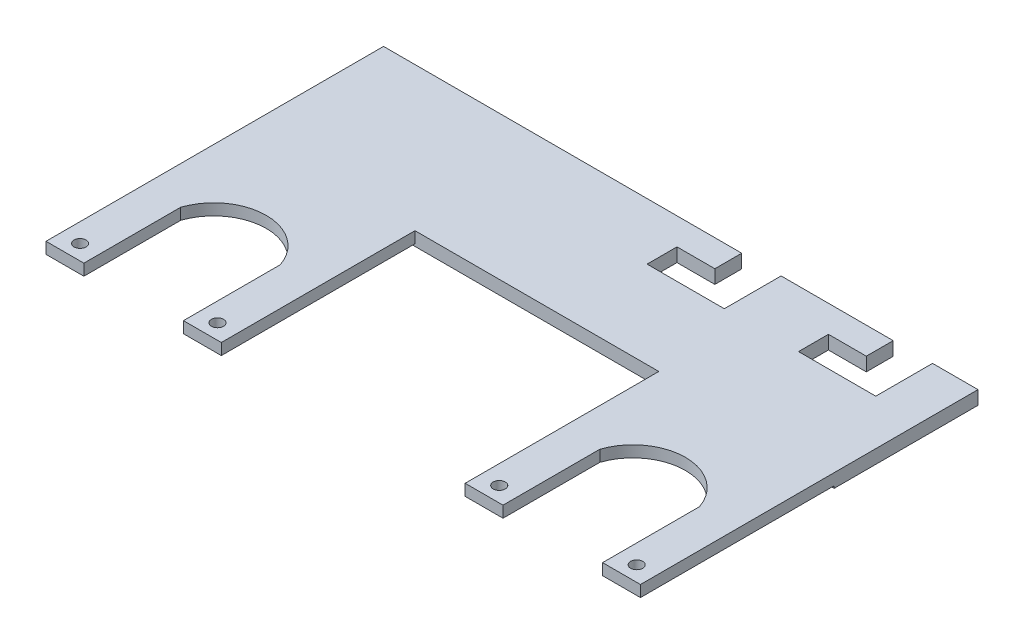
ISO-10303-21;
HEADER;
FILE_DESCRIPTION(('STEP AP214'),'2;1');
FILE_NAME('part.step','',(''),(''),'','','');
FILE_SCHEMA(('AUTOMOTIVE_DESIGN { 1 0 10303 214 1 1 1 1 }'));
ENDSEC;
DATA;
#1=APPLICATION_CONTEXT('core data for automotive mechanical design processes');
#2=APPLICATION_PROTOCOL_DEFINITION('international standard','automotive_design',2000,#1);
#3=PRODUCT_CONTEXT('',#1,'mechanical');
#4=PRODUCT('Part','Part','',(#3));
#5=PRODUCT_RELATED_PRODUCT_CATEGORY('part','',(#4));
#6=PRODUCT_DEFINITION_FORMATION('','',#4);
#7=PRODUCT_DEFINITION_CONTEXT('part definition',#1,'design');
#8=PRODUCT_DEFINITION('design','',#6,#7);
#9=PRODUCT_DEFINITION_SHAPE('','',#8);
#10=(LENGTH_UNIT() NAMED_UNIT(*) SI_UNIT(.MILLI.,.METRE.));
#11=(NAMED_UNIT(*) PLANE_ANGLE_UNIT() SI_UNIT($,.RADIAN.));
#12=(NAMED_UNIT(*) SI_UNIT($,.STERADIAN.) SOLID_ANGLE_UNIT());
#13=UNCERTAINTY_MEASURE_WITH_UNIT(LENGTH_MEASURE(1.E-05),#10,'distance_accuracy_value','');
#14=(GEOMETRIC_REPRESENTATION_CONTEXT(3) GLOBAL_UNCERTAINTY_ASSIGNED_CONTEXT((#13)) GLOBAL_UNIT_ASSIGNED_CONTEXT((#10,
#11,#12)) REPRESENTATION_CONTEXT('',''));
#15=CARTESIAN_POINT('',(0.,0.,0.));
#16=DIRECTION('',(0.,0.,1.));
#17=DIRECTION('',(1.,0.,0.));
#18=AXIS2_PLACEMENT_3D('',#15,#16,#17);
#19=CARTESIAN_POINT('',(157.,0.,-19.));
#20=DIRECTION('',(0.,0.,1.));
#21=DIRECTION('',(1.,0.,0.));
#22=AXIS2_PLACEMENT_3D('',#19,#20,#21);
#23=PLANE('',#22);
#24=DIRECTION('',(-1.,0.,0.));
#25=VECTOR('',#24,1.);
#26=CARTESIAN_POINT('',(157.,-1.8,-19.));
#27=LINE('',#26,#25);
#28=CARTESIAN_POINT('',(134.6,-1.8,-19.));
#29=VERTEX_POINT('',#28);
#30=CARTESIAN_POINT('',(105.,-1.8,-19.));
#31=VERTEX_POINT('',#30);
#32=EDGE_CURVE('E490',#29,#31,#27,.T.);
#33=ORIENTED_EDGE('',*,*,#32,.T.);
#34=DIRECTION('',(0.,1.,0.));
#35=VECTOR('',#34,1.);
#36=CARTESIAN_POINT('',(105.,0.,-19.));
#37=LINE('',#36,#35);
#38=CARTESIAN_POINT('',(105.,1.8,-19.));
#39=VERTEX_POINT('',#38);
#40=EDGE_CURVE('E320',#31,#39,#37,.T.);
#41=ORIENTED_EDGE('',*,*,#40,.T.);
#42=DIRECTION('',(-1.,0.,0.));
#43=VECTOR('',#42,1.);
#44=CARTESIAN_POINT('',(157.,1.8,-19.));
#45=LINE('',#44,#43);
#46=CARTESIAN_POINT('',(134.6,1.8,-19.));
#47=VERTEX_POINT('',#46);
#48=EDGE_CURVE('E487',#47,#39,#45,.T.);
#49=ORIENTED_EDGE('',*,*,#48,.F.);
#50=DIRECTION('',(0.,-1.,0.));
#51=VECTOR('',#50,1.);
#52=CARTESIAN_POINT('',(134.6,0.,-19.));
#53=LINE('',#52,#51);
#54=EDGE_CURVE('E63',#47,#29,#53,.T.);
#55=ORIENTED_EDGE('',*,*,#54,.T.);
#56=EDGE_LOOP('',(#33,#41,#49,#55));
#57=FACE_BOUND('',#56,.T.);
#58=ADVANCED_FACE('F41',(#57),#23,.F.);
#59=CARTESIAN_POINT('',(157.,-1.8,-19.));
#60=VERTEX_POINT('',#59);
#61=CARTESIAN_POINT('',(145.,-1.8,-19.));
#62=VERTEX_POINT('',#61);
#63=EDGE_CURVE('E488',#60,#62,#27,.T.);
#64=ORIENTED_EDGE('',*,*,#63,.T.);
#65=DIRECTION('',(0.,1.,0.));
#66=VECTOR('',#65,1.);
#67=CARTESIAN_POINT('',(145.,0.,-19.));
#68=LINE('',#67,#66);
#69=CARTESIAN_POINT('',(145.,1.8,-19.));
#70=VERTEX_POINT('',#69);
#71=EDGE_CURVE('E316',#62,#70,#68,.T.);
#72=ORIENTED_EDGE('',*,*,#71,.T.);
#73=CARTESIAN_POINT('',(157.,1.8,-19.));
#74=VERTEX_POINT('',#73);
#75=EDGE_CURVE('E484',#74,#70,#45,.T.);
#76=ORIENTED_EDGE('',*,*,#75,.F.);
#77=DIRECTION('',(0.,1.,0.));
#78=VECTOR('',#77,1.);
#79=CARTESIAN_POINT('',(157.,0.,-19.));
#80=LINE('',#79,#78);
#81=EDGE_CURVE('E461',#60,#74,#80,.T.);
#82=ORIENTED_EDGE('',*,*,#81,.F.);
#83=EDGE_LOOP('',(#64,#72,#76,#82));
#84=FACE_BOUND('',#83,.T.);
#85=ADVANCED_FACE('F596',(#84),#23,.F.);
#86=CARTESIAN_POINT('',(157.,-1.8,0.));
#87=DIRECTION('',(0.,1.,0.));
#88=DIRECTION('',(0.,0.,1.));
#89=AXIS2_PLACEMENT_3D('',#86,#87,#88);
#90=PLANE('',#89);
#91=DIRECTION('',(1.,0.,0.));
#92=VECTOR('',#91,1.);
#93=CARTESIAN_POINT('',(84.6,-1.8,-3.99999999999995));
#94=LINE('',#93,#92);
#95=CARTESIAN_POINT('',(84.6,-1.8,-3.99999999999995));
#96=VERTEX_POINT('',#95);
#97=CARTESIAN_POINT('',(105.,-1.8,-3.99999999999995));
#98=VERTEX_POINT('',#97);
#99=EDGE_CURVE('E244',#96,#98,#94,.T.);
#100=ORIENTED_EDGE('',*,*,#99,.T.);
#101=DIRECTION('',(0.,0.,-1.));
#102=VECTOR('',#101,1.);
#103=CARTESIAN_POINT('',(105.,-1.8,-3.99999999999995));
#104=LINE('',#103,#102);
#105=EDGE_CURVE('E258',#98,#31,#104,.T.);
#106=ORIENTED_EDGE('',*,*,#105,.T.);
#107=ORIENTED_EDGE('',*,*,#32,.F.);
#108=DIRECTION('',(0.,0.,1.));
#109=VECTOR('',#108,1.);
#110=CARTESIAN_POINT('',(134.6,-1.8,-19.2));
#111=LINE('',#110,#109);
#112=CARTESIAN_POINT('',(134.6,-1.8,-11.9));
#113=VERTEX_POINT('',#112);
#114=EDGE_CURVE('E310',#29,#113,#111,.T.);
#115=ORIENTED_EDGE('',*,*,#114,.T.);
#116=DIRECTION('',(-1.,0.,0.));
#117=VECTOR('',#116,1.);
#118=CARTESIAN_POINT('',(134.6,-1.8,-11.9));
#119=LINE('',#118,#117);
#120=CARTESIAN_POINT('',(124.6,-1.8,-11.9));
#121=VERTEX_POINT('',#120);
#122=EDGE_CURVE('E307',#113,#121,#119,.T.);
#123=ORIENTED_EDGE('',*,*,#122,.T.);
#124=DIRECTION('',(0.,0.,1.));
#125=VECTOR('',#124,1.);
#126=CARTESIAN_POINT('',(124.6,-1.8,-11.9));
#127=LINE('',#126,#125);
#128=CARTESIAN_POINT('',(124.6,-1.8,-3.99999999999995));
#129=VERTEX_POINT('',#128);
#130=EDGE_CURVE('E304',#121,#129,#127,.T.);
#131=ORIENTED_EDGE('',*,*,#130,.T.);
#132=DIRECTION('',(1.,0.,0.));
#133=VECTOR('',#132,1.);
#134=CARTESIAN_POINT('',(124.6,-1.8,-3.99999999999995));
#135=LINE('',#134,#133);
#136=CARTESIAN_POINT('',(145.,-1.8,-3.99999999999995));
#137=VERTEX_POINT('',#136);
#138=EDGE_CURVE('E284',#129,#137,#135,.T.);
#139=ORIENTED_EDGE('',*,*,#138,.T.);
#140=DIRECTION('',(0.,0.,-1.));
#141=VECTOR('',#140,1.);
#142=CARTESIAN_POINT('',(145.,-1.8,-3.99999999999995));
#143=LINE('',#142,#141);
#144=EDGE_CURVE('E295',#137,#62,#143,.T.);
#145=ORIENTED_EDGE('',*,*,#144,.T.);
#146=ORIENTED_EDGE('',*,*,#63,.F.);
#147=DIRECTION('',(0.,0.,-1.));
#148=VECTOR('',#147,1.);
#149=CARTESIAN_POINT('',(157.,-1.8,0.));
#150=LINE('',#149,#148);
#151=CARTESIAN_POINT('',(157.,-1.8,19.));
#152=VERTEX_POINT('',#151);
#153=EDGE_CURVE('E458',#152,#60,#150,.T.);
#154=ORIENTED_EDGE('',*,*,#153,.F.);
#155=DIRECTION('',(-1.,0.,0.));
#156=VECTOR('',#155,1.);
#157=CARTESIAN_POINT('',(157.,-1.8,19.));
#158=LINE('',#157,#156);
#159=CARTESIAN_POINT('',(0.,-1.8,19.));
#160=VERTEX_POINT('',#159);
#161=EDGE_CURVE('E470',#152,#160,#158,.T.);
#162=ORIENTED_EDGE('',*,*,#161,.T.);
#163=DIRECTION('',(0.,0.,-1.));
#164=VECTOR('',#163,1.);
#165=CARTESIAN_POINT('',(0.,-1.8,0.));
#166=LINE('',#165,#164);
#167=CARTESIAN_POINT('',(0.,-1.8,-19.));
#168=VERTEX_POINT('',#167);
#169=EDGE_CURVE('E374',#160,#168,#166,.T.);
#170=ORIENTED_EDGE('',*,*,#169,.T.);
#171=CARTESIAN_POINT('',(94.6000000000001,-1.8,-19.));
#172=VERTEX_POINT('',#171);
#173=EDGE_CURVE('E257',#172,#168,#27,.T.);
#174=ORIENTED_EDGE('',*,*,#173,.F.);
#175=DIRECTION('',(0.,0.,1.));
#176=VECTOR('',#175,1.);
#177=CARTESIAN_POINT('',(94.6000000000001,-1.8,-19.2));
#178=LINE('',#177,#176);
#179=CARTESIAN_POINT('',(94.6000000000001,-1.8,-11.9));
#180=VERTEX_POINT('',#179);
#181=EDGE_CURVE('E239',#172,#180,#178,.T.);
#182=ORIENTED_EDGE('',*,*,#181,.T.);
#183=DIRECTION('',(-1.,0.,0.));
#184=VECTOR('',#183,1.);
#185=CARTESIAN_POINT('',(94.6000000000001,-1.8,-11.9));
#186=LINE('',#185,#184);
#187=CARTESIAN_POINT('',(84.6,-1.8,-11.9));
#188=VERTEX_POINT('',#187);
#189=EDGE_CURVE('E247',#180,#188,#186,.T.);
#190=ORIENTED_EDGE('',*,*,#189,.T.);
#191=DIRECTION('',(0.,0.,1.));
#192=VECTOR('',#191,1.);
#193=CARTESIAN_POINT('',(84.6,-1.8,-11.9));
#194=LINE('',#193,#192);
#195=EDGE_CURVE('E252',#188,#96,#194,.T.);
#196=ORIENTED_EDGE('',*,*,#195,.T.);
#197=EDGE_LOOP('',(#100,#106,#107,#115,#123,#131,#139,#145,#146,#154,#162,#170,#174,#182,#190,#196));
#198=FACE_BOUND('',#197,.T.);
#199=ADVANCED_FACE('F43',(#198),#90,.F.);
#200=CARTESIAN_POINT('',(94.6000000000001,1.8,-19.));
#201=VERTEX_POINT('',#200);
#202=CARTESIAN_POINT('',(0.,1.8,-19.));
#203=VERTEX_POINT('',#202);
#204=EDGE_CURVE('E483',#201,#203,#45,.T.);
#205=ORIENTED_EDGE('',*,*,#204,.F.);
#206=DIRECTION('',(0.,-1.,0.));
#207=VECTOR('',#206,1.);
#208=CARTESIAN_POINT('',(94.6000000000001,0.,-19.));
#209=LINE('',#208,#207);
#210=EDGE_CURVE('E55',#201,#172,#209,.T.);
#211=ORIENTED_EDGE('',*,*,#210,.T.);
#212=ORIENTED_EDGE('',*,*,#173,.T.);
#213=DIRECTION('',(0.,1.,0.));
#214=VECTOR('',#213,1.);
#215=CARTESIAN_POINT('',(0.,0.,-19.));
#216=LINE('',#215,#214);
#217=EDGE_CURVE('E472',#168,#203,#216,.T.);
#218=ORIENTED_EDGE('',*,*,#217,.T.);
#219=EDGE_LOOP('',(#205,#211,#212,#218));
#220=FACE_BOUND('',#219,.T.);
#221=ADVANCED_FACE('F516',(#220),#23,.F.);
#222=CARTESIAN_POINT('',(157.,1.8,0.));
#223=DIRECTION('',(0.,1.,0.));
#224=DIRECTION('',(0.,0.,1.));
#225=AXIS2_PLACEMENT_3D('',#222,#223,#224);
#226=PLANE('',#225);
#227=DIRECTION('',(0.,0.,-1.));
#228=VECTOR('',#227,1.);
#229=CARTESIAN_POINT('',(105.,1.8,-3.99999999999995));
#230=LINE('',#229,#228);
#231=CARTESIAN_POINT('',(105.,1.8,-3.99999999999995));
#232=VERTEX_POINT('',#231);
#233=EDGE_CURVE('E266',#232,#39,#230,.T.);
#234=ORIENTED_EDGE('',*,*,#233,.F.);
#235=DIRECTION('',(1.,0.,0.));
#236=VECTOR('',#235,1.);
#237=CARTESIAN_POINT('',(84.6,1.8,-3.99999999999995));
#238=LINE('',#237,#236);
#239=CARTESIAN_POINT('',(84.6,1.8,-3.99999999999995));
#240=VERTEX_POINT('',#239);
#241=EDGE_CURVE('E261',#240,#232,#238,.T.);
#242=ORIENTED_EDGE('',*,*,#241,.F.);
#243=DIRECTION('',(0.,0.,1.));
#244=VECTOR('',#243,1.);
#245=CARTESIAN_POINT('',(84.6,1.8,-11.9));
#246=LINE('',#245,#244);
#247=CARTESIAN_POINT('',(84.6,1.8,-11.9));
#248=VERTEX_POINT('',#247);
#249=EDGE_CURVE('E271',#248,#240,#246,.T.);
#250=ORIENTED_EDGE('',*,*,#249,.F.);
#251=DIRECTION('',(-1.,0.,0.));
#252=VECTOR('',#251,1.);
#253=CARTESIAN_POINT('',(94.6000000000001,1.8,-11.9));
#254=LINE('',#253,#252);
#255=CARTESIAN_POINT('',(94.6000000000001,1.8,-11.9));
#256=VERTEX_POINT('',#255);
#257=EDGE_CURVE('E268',#256,#248,#254,.T.);
#258=ORIENTED_EDGE('',*,*,#257,.F.);
#259=DIRECTION('',(0.,0.,1.));
#260=VECTOR('',#259,1.);
#261=CARTESIAN_POINT('',(94.6000000000001,1.8,0.));
#262=LINE('',#261,#260);
#263=EDGE_CURVE('E11',#201,#256,#262,.T.);
#264=ORIENTED_EDGE('',*,*,#263,.F.);
#265=ORIENTED_EDGE('',*,*,#204,.T.);
#266=DIRECTION('',(0.,0.,-1.));
#267=VECTOR('',#266,1.);
#268=CARTESIAN_POINT('',(0.,1.8,0.));
#269=LINE('',#268,#267);
#270=CARTESIAN_POINT('',(0.,1.8,70.15));
#271=VERTEX_POINT('',#270);
#272=EDGE_CURVE('E475',#271,#203,#269,.T.);
#273=ORIENTED_EDGE('',*,*,#272,.F.);
#274=DIRECTION('',(-1.,0.,0.));
#275=VECTOR('',#274,1.);
#276=CARTESIAN_POINT('',(0.,1.8,70.15));
#277=LINE('',#276,#275);
#278=CARTESIAN_POINT('',(10.,1.8,70.15));
#279=VERTEX_POINT('',#278);
#280=EDGE_CURVE('E394',#279,#271,#277,.T.);
#281=ORIENTED_EDGE('',*,*,#280,.F.);
#282=DIRECTION('',(0.,0.,-1.));
#283=VECTOR('',#282,1.);
#284=CARTESIAN_POINT('',(10.,1.8,0.));
#285=LINE('',#284,#283);
#286=CARTESIAN_POINT('',(10.,1.8,44.575));
#287=VERTEX_POINT('',#286);
#288=EDGE_CURVE('E427',#279,#287,#285,.T.);
#289=ORIENTED_EDGE('',*,*,#288,.T.);
#290=CARTESIAN_POINT('',(23.15,1.8,49.));
#291=DIRECTION('',(0.,1.,0.));
#292=DIRECTION('',(0.,0.,1.));
#293=AXIS2_PLACEMENT_3D('',#290,#291,#292);
#294=CIRCLE('',#293,13.8745495422374);
#295=CARTESIAN_POINT('',(36.3,1.8,44.575));
#296=VERTEX_POINT('',#295);
#297=EDGE_CURVE('E430',#287,#296,#294,.F.);
#298=ORIENTED_EDGE('',*,*,#297,.T.);
#299=DIRECTION('',(0.,0.,1.));
#300=VECTOR('',#299,1.);
#301=CARTESIAN_POINT('',(36.2999999999999,1.8,0.));
#302=LINE('',#301,#300);
#303=CARTESIAN_POINT('',(36.3,1.8,70.15));
#304=VERTEX_POINT('',#303);
#305=EDGE_CURVE('E433',#296,#304,#302,.T.);
#306=ORIENTED_EDGE('',*,*,#305,.T.);
#307=DIRECTION('',(1.,0.,0.));
#308=VECTOR('',#307,1.);
#309=CARTESIAN_POINT('',(0.,1.8,70.15));
#310=LINE('',#309,#308);
#311=CARTESIAN_POINT('',(46.3,1.8,70.15));
#312=VERTEX_POINT('',#311);
#313=EDGE_CURVE('E436',#304,#312,#310,.T.);
#314=ORIENTED_EDGE('',*,*,#313,.T.);
#315=DIRECTION('',(0.,0.,-1.));
#316=VECTOR('',#315,1.);
#317=CARTESIAN_POINT('',(46.3,1.8,0.));
#318=LINE('',#317,#316);
#319=CARTESIAN_POINT('',(46.3,1.8,19.));
#320=VERTEX_POINT('',#319);
#321=EDGE_CURVE('E439',#312,#320,#318,.T.);
#322=ORIENTED_EDGE('',*,*,#321,.T.);
#323=DIRECTION('',(-1.,0.,0.));
#324=VECTOR('',#323,1.);
#325=CARTESIAN_POINT('',(157.,1.8,19.));
#326=LINE('',#325,#324);
#327=CARTESIAN_POINT('',(110.7,1.8,19.));
#328=VERTEX_POINT('',#327);
#329=EDGE_CURVE('E481',#328,#320,#326,.T.);
#330=ORIENTED_EDGE('',*,*,#329,.F.);
#331=DIRECTION('',(0.,0.,-1.));
#332=VECTOR('',#331,1.);
#333=CARTESIAN_POINT('',(110.7,1.8,0.));
#334=LINE('',#333,#332);
#335=CARTESIAN_POINT('',(110.7,1.8,70.15));
#336=VERTEX_POINT('',#335);
#337=EDGE_CURVE('E363',#336,#328,#334,.T.);
#338=ORIENTED_EDGE('',*,*,#337,.F.);
#339=DIRECTION('',(-1.,0.,0.));
#340=VECTOR('',#339,1.);
#341=CARTESIAN_POINT('',(0.,1.8,70.15));
#342=LINE('',#341,#340);
#343=CARTESIAN_POINT('',(120.7,1.8,70.15));
#344=VERTEX_POINT('',#343);
#345=EDGE_CURVE('E365',#344,#336,#342,.T.);
#346=ORIENTED_EDGE('',*,*,#345,.F.);
#347=DIRECTION('',(0.,0.,-1.));
#348=VECTOR('',#347,1.);
#349=CARTESIAN_POINT('',(120.7,1.8,0.));
#350=LINE('',#349,#348);
#351=CARTESIAN_POINT('',(120.7,1.8,44.575));
#352=VERTEX_POINT('',#351);
#353=EDGE_CURVE('E367',#344,#352,#350,.T.);
#354=ORIENTED_EDGE('',*,*,#353,.T.);
#355=CARTESIAN_POINT('',(133.85,1.8,49.));
#356=DIRECTION('',(0.,1.,0.));
#357=DIRECTION('',(0.,0.,1.));
#358=AXIS2_PLACEMENT_3D('',#355,#356,#357);
#359=CIRCLE('',#358,13.8745495422374);
#360=CARTESIAN_POINT('',(147.,1.8,44.575));
#361=VERTEX_POINT('',#360);
#362=EDGE_CURVE('E354',#361,#352,#359,.T.);
#363=ORIENTED_EDGE('',*,*,#362,.F.);
#364=DIRECTION('',(0.,0.,-1.));
#365=VECTOR('',#364,1.);
#366=CARTESIAN_POINT('',(147.,1.8,-9.22049630620891E-13));
#367=LINE('',#366,#365);
#368=CARTESIAN_POINT('',(147.,1.8,70.15));
#369=VERTEX_POINT('',#368);
#370=EDGE_CURVE('E358',#369,#361,#367,.T.);
#371=ORIENTED_EDGE('',*,*,#370,.F.);
#372=DIRECTION('',(1.,0.,0.));
#373=VECTOR('',#372,1.);
#374=CARTESIAN_POINT('',(0.,1.8,70.15));
#375=LINE('',#374,#373);
#376=CARTESIAN_POINT('',(157.,1.8,70.15));
#377=VERTEX_POINT('',#376);
#378=EDGE_CURVE('E360',#369,#377,#375,.T.);
#379=ORIENTED_EDGE('',*,*,#378,.T.);
#380=DIRECTION('',(0.,0.,-1.));
#381=VECTOR('',#380,1.);
#382=CARTESIAN_POINT('',(157.,1.8,0.));
#383=LINE('',#382,#381);
#384=EDGE_CURVE('E464',#377,#74,#383,.T.);
#385=ORIENTED_EDGE('',*,*,#384,.T.);
#386=ORIENTED_EDGE('',*,*,#75,.T.);
#387=DIRECTION('',(0.,0.,-1.));
#388=VECTOR('',#387,1.);
#389=CARTESIAN_POINT('',(145.,1.8,-3.99999999999995));
#390=LINE('',#389,#388);
#391=CARTESIAN_POINT('',(145.,1.8,-3.99999999999995));
#392=VERTEX_POINT('',#391);
#393=EDGE_CURVE('E269',#392,#70,#390,.T.);
#394=ORIENTED_EDGE('',*,*,#393,.F.);
#395=DIRECTION('',(1.,0.,0.));
#396=VECTOR('',#395,1.);
#397=CARTESIAN_POINT('',(124.6,1.8,-3.99999999999995));
#398=LINE('',#397,#396);
#399=CARTESIAN_POINT('',(124.6,1.8,-3.99999999999995));
#400=VERTEX_POINT('',#399);
#401=EDGE_CURVE('E291',#400,#392,#398,.T.);
#402=ORIENTED_EDGE('',*,*,#401,.F.);
#403=DIRECTION('',(0.,0.,1.));
#404=VECTOR('',#403,1.);
#405=CARTESIAN_POINT('',(124.6,1.8,-11.9));
#406=LINE('',#405,#404);
#407=CARTESIAN_POINT('',(124.6,1.8,-11.9));
#408=VERTEX_POINT('',#407);
#409=EDGE_CURVE('E294',#408,#400,#406,.T.);
#410=ORIENTED_EDGE('',*,*,#409,.F.);
#411=DIRECTION('',(-1.,0.,0.));
#412=VECTOR('',#411,1.);
#413=CARTESIAN_POINT('',(134.6,1.8,-11.9));
#414=LINE('',#413,#412);
#415=CARTESIAN_POINT('',(134.6,1.8,-11.9));
#416=VERTEX_POINT('',#415);
#417=EDGE_CURVE('E298',#416,#408,#414,.T.);
#418=ORIENTED_EDGE('',*,*,#417,.F.);
#419=DIRECTION('',(0.,0.,1.));
#420=VECTOR('',#419,1.);
#421=CARTESIAN_POINT('',(134.6,1.8,0.));
#422=LINE('',#421,#420);
#423=EDGE_CURVE('E49',#47,#416,#422,.T.);
#424=ORIENTED_EDGE('',*,*,#423,.F.);
#425=ORIENTED_EDGE('',*,*,#48,.T.);
#426=EDGE_LOOP('',(#234,#242,#250,#258,#264,#265,#273,#281,#289,#298,#306,#314,#322,#330,#338,
#346,#354,#363,#371,#379,#385,#386,#394,#402,#410,#418,#424,#425));
#427=FACE_BOUND('',#426,.T.);
#428=CARTESIAN_POINT('',(5.,1.8,66.15));
#429=DIRECTION('',(0.,1.,0.));
#430=DIRECTION('',(0.,0.,1.));
#431=AXIS2_PLACEMENT_3D('',#428,#429,#430);
#432=CIRCLE('',#431,1.6);
#433=CARTESIAN_POINT('',(5.,1.8,67.75));
#434=VERTEX_POINT('',#433);
#435=EDGE_CURVE('E323',#434,#434,#432,.T.);
#436=ORIENTED_EDGE('',*,*,#435,.F.);
#437=EDGE_LOOP('',(#436));
#438=FACE_BOUND('',#437,.T.);
#439=CARTESIAN_POINT('',(41.3,1.8,66.15));
#440=DIRECTION('',(0.,1.,0.));
#441=DIRECTION('',(0.,0.,1.));
#442=AXIS2_PLACEMENT_3D('',#439,#440,#441);
#443=CIRCLE('',#442,1.60000000000001);
#444=CARTESIAN_POINT('',(41.3,1.8,67.75));
#445=VERTEX_POINT('',#444);
#446=EDGE_CURVE('E424',#445,#445,#443,.T.);
#447=ORIENTED_EDGE('',*,*,#446,.F.);
#448=EDGE_LOOP('',(#447));
#449=FACE_BOUND('',#448,.T.);
#450=CARTESIAN_POINT('',(115.7,1.8,66.15));
#451=DIRECTION('',(0.,1.,0.));
#452=DIRECTION('',(0.,0.,1.));
#453=AXIS2_PLACEMENT_3D('',#450,#451,#452);
#454=CIRCLE('',#453,1.60000000000001);
#455=CARTESIAN_POINT('',(115.7,1.8,67.75));
#456=VERTEX_POINT('',#455);
#457=EDGE_CURVE('E351',#456,#456,#454,.F.);
#458=ORIENTED_EDGE('',*,*,#457,.T.);
#459=EDGE_LOOP('',(#458));
#460=FACE_BOUND('',#459,.T.);
#461=CARTESIAN_POINT('',(152.,1.8,66.15));
#462=DIRECTION('',(0.,1.,0.));
#463=DIRECTION('',(0.,0.,1.));
#464=AXIS2_PLACEMENT_3D('',#461,#462,#463);
#465=CIRCLE('',#464,1.59999999999999);
#466=CARTESIAN_POINT('',(152.,1.8,67.75));
#467=VERTEX_POINT('',#466);
#468=EDGE_CURVE('E328',#467,#467,#465,.F.);
#469=ORIENTED_EDGE('',*,*,#468,.T.);
#470=EDGE_LOOP('',(#469));
#471=FACE_BOUND('',#470,.T.);
#472=ADVANCED_FACE('F501',(#427,#438,#449,#460,#471),#226,.T.);
#473=CARTESIAN_POINT('',(157.,0.,19.));
#474=DIRECTION('',(0.,0.,1.));
#475=DIRECTION('',(1.,0.,0.));
#476=AXIS2_PLACEMENT_3D('',#473,#474,#475);
#477=PLANE('',#476);
#478=DIRECTION('',(1.,0.,0.));
#479=VECTOR('',#478,1.);
#480=CARTESIAN_POINT('',(0.,-1.2,19.));
#481=LINE('',#480,#479);
#482=CARTESIAN_POINT('',(110.7,-1.2,19.));
#483=VERTEX_POINT('',#482);
#484=CARTESIAN_POINT('',(157.,-1.2,19.));
#485=VERTEX_POINT('',#484);
#486=EDGE_CURVE('E338',#483,#485,#481,.T.);
#487=ORIENTED_EDGE('',*,*,#486,.F.);
#488=DIRECTION('',(0.,1.,0.));
#489=VECTOR('',#488,1.);
#490=CARTESIAN_POINT('',(110.7,-1.2,19.));
#491=LINE('',#490,#489);
#492=EDGE_CURVE('E380',#483,#328,#491,.T.);
#493=ORIENTED_EDGE('',*,*,#492,.T.);
#494=ORIENTED_EDGE('',*,*,#329,.T.);
#495=DIRECTION('',(0.,1.,0.));
#496=VECTOR('',#495,1.);
#497=CARTESIAN_POINT('',(46.3,-1.2,19.));
#498=LINE('',#497,#496);
#499=CARTESIAN_POINT('',(46.3,-1.2,19.));
#500=VERTEX_POINT('',#499);
#501=EDGE_CURVE('E448',#500,#320,#498,.T.);
#502=ORIENTED_EDGE('',*,*,#501,.F.);
#503=DIRECTION('',(1.,0.,0.));
#504=VECTOR('',#503,1.);
#505=CARTESIAN_POINT('',(0.,-1.2,19.));
#506=LINE('',#505,#504);
#507=CARTESIAN_POINT('',(0.,-1.2,19.));
#508=VERTEX_POINT('',#507);
#509=EDGE_CURVE('E412',#508,#500,#506,.T.);
#510=ORIENTED_EDGE('',*,*,#509,.F.);
#511=DIRECTION('',(0.,1.,0.));
#512=VECTOR('',#511,1.);
#513=CARTESIAN_POINT('',(0.,0.,19.));
#514=LINE('',#513,#512);
#515=EDGE_CURVE('E462',#160,#508,#514,.T.);
#516=ORIENTED_EDGE('',*,*,#515,.F.);
#517=ORIENTED_EDGE('',*,*,#161,.F.);
#518=DIRECTION('',(0.,1.,0.));
#519=VECTOR('',#518,1.);
#520=CARTESIAN_POINT('',(157.,0.,19.));
#521=LINE('',#520,#519);
#522=EDGE_CURVE('E467',#152,#485,#521,.T.);
#523=ORIENTED_EDGE('',*,*,#522,.T.);
#524=EDGE_LOOP('',(#487,#493,#494,#502,#510,#516,#517,#523));
#525=FACE_BOUND('',#524,.T.);
#526=ADVANCED_FACE('F549',(#525),#477,.T.);
#527=CARTESIAN_POINT('',(157.,0.,0.));
#528=DIRECTION('',(1.,0.,0.));
#529=DIRECTION('',(0.,0.,-1.));
#530=AXIS2_PLACEMENT_3D('',#527,#528,#529);
#531=PLANE('',#530);
#532=ORIENTED_EDGE('',*,*,#153,.T.);
#533=ORIENTED_EDGE('',*,*,#81,.T.);
#534=ORIENTED_EDGE('',*,*,#384,.F.);
#535=DIRECTION('',(0.,1.,0.));
#536=VECTOR('',#535,1.);
#537=CARTESIAN_POINT('',(157.,-1.2,70.15));
#538=LINE('',#537,#536);
#539=CARTESIAN_POINT('',(157.,-1.2,70.15));
#540=VERTEX_POINT('',#539);
#541=EDGE_CURVE('E383',#540,#377,#538,.T.);
#542=ORIENTED_EDGE('',*,*,#541,.F.);
#543=DIRECTION('',(0.,0.,-1.));
#544=VECTOR('',#543,1.);
#545=CARTESIAN_POINT('',(157.,-1.2,0.));
#546=LINE('',#545,#544);
#547=EDGE_CURVE('E335',#540,#485,#546,.T.);
#548=ORIENTED_EDGE('',*,*,#547,.T.);
#549=ORIENTED_EDGE('',*,*,#522,.F.);
#550=EDGE_LOOP('',(#532,#533,#534,#542,#548,#549));
#551=FACE_BOUND('',#550,.T.);
#552=ADVANCED_FACE('F577',(#551),#531,.T.);
#553=CARTESIAN_POINT('',(0.,0.,0.));
#554=DIRECTION('',(1.,0.,0.));
#555=DIRECTION('',(0.,0.,-1.));
#556=AXIS2_PLACEMENT_3D('',#553,#554,#555);
#557=PLANE('',#556);
#558=ORIENTED_EDGE('',*,*,#169,.F.);
#559=ORIENTED_EDGE('',*,*,#515,.T.);
#560=DIRECTION('',(0.,0.,-1.));
#561=VECTOR('',#560,1.);
#562=CARTESIAN_POINT('',(0.,-1.2,0.));
#563=LINE('',#562,#561);
#564=CARTESIAN_POINT('',(0.,-1.2,70.15));
#565=VERTEX_POINT('',#564);
#566=EDGE_CURVE('E415',#565,#508,#563,.T.);
#567=ORIENTED_EDGE('',*,*,#566,.F.);
#568=DIRECTION('',(0.,1.,0.));
#569=VECTOR('',#568,1.);
#570=CARTESIAN_POINT('',(0.,-1.2,70.15));
#571=LINE('',#570,#569);
#572=EDGE_CURVE('E445',#565,#271,#571,.T.);
#573=ORIENTED_EDGE('',*,*,#572,.T.);
#574=ORIENTED_EDGE('',*,*,#272,.T.);
#575=ORIENTED_EDGE('',*,*,#217,.F.);
#576=EDGE_LOOP('',(#558,#559,#567,#573,#574,#575));
#577=FACE_BOUND('',#576,.T.);
#578=ADVANCED_FACE('F519',(#577),#557,.F.);
#579=CARTESIAN_POINT('',(10.,-1.2,0.));
#580=DIRECTION('',(1.,0.,0.));
#581=DIRECTION('',(0.,0.,-1.));
#582=AXIS2_PLACEMENT_3D('',#579,#580,#581);
#583=PLANE('',#582);
#584=ORIENTED_EDGE('',*,*,#288,.F.);
#585=DIRECTION('',(0.,1.,0.));
#586=VECTOR('',#585,1.);
#587=CARTESIAN_POINT('',(10.,-1.2,70.15));
#588=LINE('',#587,#586);
#589=CARTESIAN_POINT('',(10.,-1.2,70.15));
#590=VERTEX_POINT('',#589);
#591=EDGE_CURVE('E355',#590,#279,#588,.T.);
#592=ORIENTED_EDGE('',*,*,#591,.F.);
#593=DIRECTION('',(0.,0.,-1.));
#594=VECTOR('',#593,1.);
#595=CARTESIAN_POINT('',(10.,-1.2,0.));
#596=LINE('',#595,#594);
#597=CARTESIAN_POINT('',(10.,-1.2,44.575));
#598=VERTEX_POINT('',#597);
#599=EDGE_CURVE('E397',#590,#598,#596,.T.);
#600=ORIENTED_EDGE('',*,*,#599,.T.);
#601=DIRECTION('',(0.,1.,0.));
#602=VECTOR('',#601,1.);
#603=CARTESIAN_POINT('',(10.,-1.2,44.575));
#604=LINE('',#603,#602);
#605=EDGE_CURVE('E421',#598,#287,#604,.T.);
#606=ORIENTED_EDGE('',*,*,#605,.T.);
#607=EDGE_LOOP('',(#584,#592,#600,#606));
#608=FACE_BOUND('',#607,.T.);
#609=ADVANCED_FACE('F526',(#608),#583,.T.);
#610=CARTESIAN_POINT('',(0.,-1.2,70.15));
#611=DIRECTION('',(0.,0.,-1.));
#612=DIRECTION('',(-1.,0.,0.));
#613=AXIS2_PLACEMENT_3D('',#610,#611,#612);
#614=PLANE('',#613);
#615=ORIENTED_EDGE('',*,*,#280,.T.);
#616=ORIENTED_EDGE('',*,*,#572,.F.);
#617=DIRECTION('',(-1.,0.,0.));
#618=VECTOR('',#617,1.);
#619=CARTESIAN_POINT('',(0.,-1.2,70.15));
#620=LINE('',#619,#618);
#621=EDGE_CURVE('E418',#590,#565,#620,.T.);
#622=ORIENTED_EDGE('',*,*,#621,.F.);
#623=ORIENTED_EDGE('',*,*,#591,.T.);
#624=EDGE_LOOP('',(#615,#616,#622,#623));
#625=FACE_BOUND('',#624,.T.);
#626=ADVANCED_FACE('F523',(#625),#614,.F.);
#627=CARTESIAN_POINT('',(46.3,-1.2,0.));
#628=DIRECTION('',(1.,0.,0.));
#629=DIRECTION('',(0.,0.,-1.));
#630=AXIS2_PLACEMENT_3D('',#627,#628,#629);
#631=PLANE('',#630);
#632=ORIENTED_EDGE('',*,*,#321,.F.);
#633=DIRECTION('',(0.,1.,0.));
#634=VECTOR('',#633,1.);
#635=CARTESIAN_POINT('',(46.3,-1.2,70.15));
#636=LINE('',#635,#634);
#637=CARTESIAN_POINT('',(46.3,-1.2,70.15));
#638=VERTEX_POINT('',#637);
#639=EDGE_CURVE('E451',#638,#312,#636,.T.);
#640=ORIENTED_EDGE('',*,*,#639,.F.);
#641=DIRECTION('',(0.,0.,-1.));
#642=VECTOR('',#641,1.);
#643=CARTESIAN_POINT('',(46.3,-1.2,0.));
#644=LINE('',#643,#642);
#645=EDGE_CURVE('E409',#638,#500,#644,.T.);
#646=ORIENTED_EDGE('',*,*,#645,.T.);
#647=ORIENTED_EDGE('',*,*,#501,.T.);
#648=EDGE_LOOP('',(#632,#640,#646,#647));
#649=FACE_BOUND('',#648,.T.);
#650=ADVANCED_FACE('F543',(#649),#631,.T.);
#651=CARTESIAN_POINT('',(0.,-1.2,70.15));
#652=DIRECTION('',(0.,0.,1.));
#653=DIRECTION('',(1.,0.,0.));
#654=AXIS2_PLACEMENT_3D('',#651,#652,#653);
#655=PLANE('',#654);
#656=ORIENTED_EDGE('',*,*,#313,.F.);
#657=DIRECTION('',(0.,1.,0.));
#658=VECTOR('',#657,1.);
#659=CARTESIAN_POINT('',(36.3,-1.2,70.15));
#660=LINE('',#659,#658);
#661=CARTESIAN_POINT('',(36.3,-1.2,70.15));
#662=VERTEX_POINT('',#661);
#663=EDGE_CURVE('E453',#662,#304,#660,.T.);
#664=ORIENTED_EDGE('',*,*,#663,.F.);
#665=DIRECTION('',(1.,0.,0.));
#666=VECTOR('',#665,1.);
#667=CARTESIAN_POINT('',(0.,-1.2,70.15));
#668=LINE('',#667,#666);
#669=EDGE_CURVE('E406',#662,#638,#668,.T.);
#670=ORIENTED_EDGE('',*,*,#669,.T.);
#671=ORIENTED_EDGE('',*,*,#639,.T.);
#672=EDGE_LOOP('',(#656,#664,#670,#671));
#673=FACE_BOUND('',#672,.T.);
#674=ADVANCED_FACE('F539',(#673),#655,.T.);
#675=CARTESIAN_POINT('',(36.2999999999999,-1.2,0.));
#676=DIRECTION('',(-1.,0.,0.));
#677=DIRECTION('',(0.,0.,1.));
#678=AXIS2_PLACEMENT_3D('',#675,#676,#677);
#679=PLANE('',#678);
#680=ORIENTED_EDGE('',*,*,#305,.F.);
#681=DIRECTION('',(0.,1.,0.));
#682=VECTOR('',#681,1.);
#683=CARTESIAN_POINT('',(36.3,-1.2,44.575));
#684=LINE('',#683,#682);
#685=CARTESIAN_POINT('',(36.3,-1.2,44.575));
#686=VERTEX_POINT('',#685);
#687=EDGE_CURVE('E455',#686,#296,#684,.T.);
#688=ORIENTED_EDGE('',*,*,#687,.F.);
#689=DIRECTION('',(0.,0.,1.));
#690=VECTOR('',#689,1.);
#691=CARTESIAN_POINT('',(36.2999999999999,-1.2,0.));
#692=LINE('',#691,#690);
#693=EDGE_CURVE('E403',#686,#662,#692,.T.);
#694=ORIENTED_EDGE('',*,*,#693,.T.);
#695=ORIENTED_EDGE('',*,*,#663,.T.);
#696=EDGE_LOOP('',(#680,#688,#694,#695));
#697=FACE_BOUND('',#696,.T.);
#698=ADVANCED_FACE('F535',(#697),#679,.T.);
#699=CARTESIAN_POINT('',(41.3,-1.2,66.15));
#700=DIRECTION('',(0.,1.,0.));
#701=DIRECTION('',(0.,0.,1.));
#702=AXIS2_PLACEMENT_3D('',#699,#700,#701);
#703=CYLINDRICAL_SURFACE('',#702,1.60000000000001);
#704=CARTESIAN_POINT('',(41.3,-1.2,66.15));
#705=DIRECTION('',(0.,1.,0.));
#706=DIRECTION('',(0.,0.,1.));
#707=AXIS2_PLACEMENT_3D('',#704,#705,#706);
#708=CIRCLE('',#707,1.60000000000001);
#709=CARTESIAN_POINT('',(41.3,-1.2,67.75));
#710=VERTEX_POINT('',#709);
#711=EDGE_CURVE('E393',#710,#710,#708,.T.);
#712=ORIENTED_EDGE('',*,*,#711,.F.);
#713=EDGE_LOOP('',(#712));
#714=FACE_BOUND('',#713,.T.);
#715=ORIENTED_EDGE('',*,*,#446,.T.);
#716=EDGE_LOOP('',(#715));
#717=FACE_BOUND('',#716,.T.);
#718=ADVANCED_FACE('F788',(#714,#717),#703,.F.);
#719=CARTESIAN_POINT('',(5.,-1.2,66.15));
#720=DIRECTION('',(0.,1.,0.));
#721=DIRECTION('',(0.,0.,1.));
#722=AXIS2_PLACEMENT_3D('',#719,#720,#721);
#723=CYLINDRICAL_SURFACE('',#722,1.6);
#724=CARTESIAN_POINT('',(5.,-1.2,66.15));
#725=DIRECTION('',(0.,1.,0.));
#726=DIRECTION('',(0.,0.,1.));
#727=AXIS2_PLACEMENT_3D('',#724,#725,#726);
#728=CIRCLE('',#727,1.6);
#729=CARTESIAN_POINT('',(5.,-1.2,67.75));
#730=VERTEX_POINT('',#729);
#731=EDGE_CURVE('E390',#730,#730,#728,.T.);
#732=ORIENTED_EDGE('',*,*,#731,.F.);
#733=EDGE_LOOP('',(#732));
#734=FACE_BOUND('',#733,.T.);
#735=ORIENTED_EDGE('',*,*,#435,.T.);
#736=EDGE_LOOP('',(#735));
#737=FACE_BOUND('',#736,.T.);
#738=ADVANCED_FACE('F800',(#734,#737),#723,.F.);
#739=CARTESIAN_POINT('',(23.15,-1.2,49.));
#740=DIRECTION('',(0.,1.,0.));
#741=DIRECTION('',(0.,0.,1.));
#742=AXIS2_PLACEMENT_3D('',#739,#740,#741);
#743=CYLINDRICAL_SURFACE('',#742,13.8745495422374);
#744=ORIENTED_EDGE('',*,*,#297,.F.);
#745=ORIENTED_EDGE('',*,*,#605,.F.);
#746=CARTESIAN_POINT('',(23.15,-1.2,49.));
#747=DIRECTION('',(0.,1.,0.));
#748=DIRECTION('',(0.,0.,1.));
#749=AXIS2_PLACEMENT_3D('',#746,#747,#748);
#750=CIRCLE('',#749,13.8745495422374);
#751=EDGE_CURVE('E400',#598,#686,#750,.F.);
#752=ORIENTED_EDGE('',*,*,#751,.T.);
#753=ORIENTED_EDGE('',*,*,#687,.T.);
#754=EDGE_LOOP('',(#744,#745,#752,#753));
#755=FACE_BOUND('',#754,.T.);
#756=ADVANCED_FACE('F531',(#755),#743,.F.);
#757=CARTESIAN_POINT('',(0.,-1.2,0.));
#758=DIRECTION('',(0.,1.,0.));
#759=DIRECTION('',(0.,0.,1.));
#760=AXIS2_PLACEMENT_3D('',#757,#758,#759);
#761=PLANE('',#760);
#762=ORIENTED_EDGE('',*,*,#731,.T.);
#763=EDGE_LOOP('',(#762));
#764=FACE_BOUND('',#763,.T.);
#765=ORIENTED_EDGE('',*,*,#711,.T.);
#766=EDGE_LOOP('',(#765));
#767=FACE_BOUND('',#766,.T.);
#768=ORIENTED_EDGE('',*,*,#599,.F.);
#769=ORIENTED_EDGE('',*,*,#621,.T.);
#770=ORIENTED_EDGE('',*,*,#566,.T.);
#771=ORIENTED_EDGE('',*,*,#509,.T.);
#772=ORIENTED_EDGE('',*,*,#645,.F.);
#773=ORIENTED_EDGE('',*,*,#669,.F.);
#774=ORIENTED_EDGE('',*,*,#693,.F.);
#775=ORIENTED_EDGE('',*,*,#751,.F.);
#776=EDGE_LOOP('',(#768,#769,#770,#771,#772,#773,#774,#775));
#777=FACE_BOUND('',#776,.T.);
#778=ADVANCED_FACE('F819',(#764,#767,#777),#761,.F.);
#779=CARTESIAN_POINT('',(133.85,-1.2,49.));
#780=DIRECTION('',(0.,1.,0.));
#781=DIRECTION('',(0.,0.,1.));
#782=AXIS2_PLACEMENT_3D('',#779,#780,#781);
#783=CYLINDRICAL_SURFACE('',#782,13.8745495422374);
#784=ORIENTED_EDGE('',*,*,#362,.T.);
#785=DIRECTION('',(0.,1.,0.));
#786=VECTOR('',#785,1.);
#787=CARTESIAN_POINT('',(120.7,-1.2,44.575));
#788=LINE('',#787,#786);
#789=CARTESIAN_POINT('',(120.7,-1.2,44.575));
#790=VERTEX_POINT('',#789);
#791=EDGE_CURVE('E372',#790,#352,#788,.T.);
#792=ORIENTED_EDGE('',*,*,#791,.F.);
#793=CARTESIAN_POINT('',(133.85,-1.2,49.));
#794=DIRECTION('',(0.,1.,0.));
#795=DIRECTION('',(0.,0.,1.));
#796=AXIS2_PLACEMENT_3D('',#793,#794,#795);
#797=CIRCLE('',#796,13.8745495422374);
#798=CARTESIAN_POINT('',(147.,-1.2,44.575));
#799=VERTEX_POINT('',#798);
#800=EDGE_CURVE('E327',#799,#790,#797,.T.);
#801=ORIENTED_EDGE('',*,*,#800,.F.);
#802=DIRECTION('',(0.,1.,0.));
#803=VECTOR('',#802,1.);
#804=CARTESIAN_POINT('',(147.,-1.2,44.575));
#805=LINE('',#804,#803);
#806=EDGE_CURVE('E350',#799,#361,#805,.T.);
#807=ORIENTED_EDGE('',*,*,#806,.T.);
#808=EDGE_LOOP('',(#784,#792,#801,#807));
#809=FACE_BOUND('',#808,.T.);
#810=ADVANCED_FACE('F566',(#809),#783,.F.);
#811=CARTESIAN_POINT('',(120.7,-1.2,0.));
#812=DIRECTION('',(1.,0.,0.));
#813=DIRECTION('',(0.,0.,-1.));
#814=AXIS2_PLACEMENT_3D('',#811,#812,#813);
#815=PLANE('',#814);
#816=ORIENTED_EDGE('',*,*,#353,.F.);
#817=DIRECTION('',(0.,1.,0.));
#818=VECTOR('',#817,1.);
#819=CARTESIAN_POINT('',(120.7,-1.2,70.15));
#820=LINE('',#819,#818);
#821=CARTESIAN_POINT('',(120.7,-1.2,70.15));
#822=VERTEX_POINT('',#821);
#823=EDGE_CURVE('E375',#822,#344,#820,.T.);
#824=ORIENTED_EDGE('',*,*,#823,.F.);
#825=DIRECTION('',(0.,0.,-1.));
#826=VECTOR('',#825,1.);
#827=CARTESIAN_POINT('',(120.7,-1.2,0.));
#828=LINE('',#827,#826);
#829=EDGE_CURVE('E344',#822,#790,#828,.T.);
#830=ORIENTED_EDGE('',*,*,#829,.T.);
#831=ORIENTED_EDGE('',*,*,#791,.T.);
#832=EDGE_LOOP('',(#816,#824,#830,#831));
#833=FACE_BOUND('',#832,.T.);
#834=ADVANCED_FACE('F562',(#833),#815,.T.);
#835=CARTESIAN_POINT('',(0.,-1.2,70.15));
#836=DIRECTION('',(0.,0.,-1.));
#837=DIRECTION('',(-1.,0.,0.));
#838=AXIS2_PLACEMENT_3D('',#835,#836,#837);
#839=PLANE('',#838);
#840=ORIENTED_EDGE('',*,*,#345,.T.);
#841=DIRECTION('',(0.,1.,0.));
#842=VECTOR('',#841,1.);
#843=CARTESIAN_POINT('',(110.7,-1.2,70.15));
#844=LINE('',#843,#842);
#845=CARTESIAN_POINT('',(110.7,-1.2,70.15));
#846=VERTEX_POINT('',#845);
#847=EDGE_CURVE('E377',#846,#336,#844,.T.);
#848=ORIENTED_EDGE('',*,*,#847,.F.);
#849=DIRECTION('',(-1.,0.,0.));
#850=VECTOR('',#849,1.);
#851=CARTESIAN_POINT('',(0.,-1.2,70.15));
#852=LINE('',#851,#850);
#853=EDGE_CURVE('E342',#822,#846,#852,.T.);
#854=ORIENTED_EDGE('',*,*,#853,.F.);
#855=ORIENTED_EDGE('',*,*,#823,.T.);
#856=EDGE_LOOP('',(#840,#848,#854,#855));
#857=FACE_BOUND('',#856,.T.);
#858=ADVANCED_FACE('F557',(#857),#839,.F.);
#859=CARTESIAN_POINT('',(110.7,-1.2,0.));
#860=DIRECTION('',(1.,0.,0.));
#861=DIRECTION('',(0.,0.,-1.));
#862=AXIS2_PLACEMENT_3D('',#859,#860,#861);
#863=PLANE('',#862);
#864=ORIENTED_EDGE('',*,*,#337,.T.);
#865=ORIENTED_EDGE('',*,*,#492,.F.);
#866=DIRECTION('',(0.,0.,-1.));
#867=VECTOR('',#866,1.);
#868=CARTESIAN_POINT('',(110.7,-1.2,0.));
#869=LINE('',#868,#867);
#870=EDGE_CURVE('E340',#846,#483,#869,.T.);
#871=ORIENTED_EDGE('',*,*,#870,.F.);
#872=ORIENTED_EDGE('',*,*,#847,.T.);
#873=EDGE_LOOP('',(#864,#865,#871,#872));
#874=FACE_BOUND('',#873,.T.);
#875=ADVANCED_FACE('F553',(#874),#863,.F.);
#876=CARTESIAN_POINT('',(0.,-1.2,70.15));
#877=DIRECTION('',(0.,0.,1.));
#878=DIRECTION('',(1.,0.,0.));
#879=AXIS2_PLACEMENT_3D('',#876,#877,#878);
#880=PLANE('',#879);
#881=ORIENTED_EDGE('',*,*,#378,.F.);
#882=DIRECTION('',(0.,1.,0.));
#883=VECTOR('',#882,1.);
#884=CARTESIAN_POINT('',(147.,-1.2,70.15));
#885=LINE('',#884,#883);
#886=CARTESIAN_POINT('',(147.,-1.2,70.15));
#887=VERTEX_POINT('',#886);
#888=EDGE_CURVE('E386',#887,#369,#885,.T.);
#889=ORIENTED_EDGE('',*,*,#888,.F.);
#890=DIRECTION('',(1.,0.,0.));
#891=VECTOR('',#890,1.);
#892=CARTESIAN_POINT('',(0.,-1.2,70.15));
#893=LINE('',#892,#891);
#894=EDGE_CURVE('E332',#887,#540,#893,.T.);
#895=ORIENTED_EDGE('',*,*,#894,.T.);
#896=ORIENTED_EDGE('',*,*,#541,.T.);
#897=EDGE_LOOP('',(#881,#889,#895,#896));
#898=FACE_BOUND('',#897,.T.);
#899=ADVANCED_FACE('F572',(#898),#880,.T.);
#900=CARTESIAN_POINT('',(147.,-1.2,-9.22049630620891E-13));
#901=DIRECTION('',(1.,0.,0.));
#902=DIRECTION('',(0.,0.,-1.));
#903=AXIS2_PLACEMENT_3D('',#900,#901,#902);
#904=PLANE('',#903);
#905=ORIENTED_EDGE('',*,*,#370,.T.);
#906=ORIENTED_EDGE('',*,*,#806,.F.);
#907=DIRECTION('',(0.,0.,-1.));
#908=VECTOR('',#907,1.);
#909=CARTESIAN_POINT('',(147.,-1.2,-9.22049630620891E-13));
#910=LINE('',#909,#908);
#911=EDGE_CURVE('E330',#887,#799,#910,.T.);
#912=ORIENTED_EDGE('',*,*,#911,.F.);
#913=ORIENTED_EDGE('',*,*,#888,.T.);
#914=EDGE_LOOP('',(#905,#906,#912,#913));
#915=FACE_BOUND('',#914,.T.);
#916=ADVANCED_FACE('F582',(#915),#904,.F.);
#917=CARTESIAN_POINT('',(115.7,-1.2,66.15));
#918=DIRECTION('',(0.,1.,0.));
#919=DIRECTION('',(0.,0.,1.));
#920=AXIS2_PLACEMENT_3D('',#917,#918,#919);
#921=CYLINDRICAL_SURFACE('',#920,1.60000000000001);
#922=CARTESIAN_POINT('',(115.7,-1.2,66.15));
#923=DIRECTION('',(0.,1.,0.));
#924=DIRECTION('',(0.,0.,1.));
#925=AXIS2_PLACEMENT_3D('',#922,#923,#924);
#926=CIRCLE('',#925,1.60000000000001);
#927=CARTESIAN_POINT('',(115.7,-1.2,67.75));
#928=VERTEX_POINT('',#927);
#929=EDGE_CURVE('E324',#928,#928,#926,.F.);
#930=ORIENTED_EDGE('',*,*,#929,.T.);
#931=EDGE_LOOP('',(#930));
#932=FACE_BOUND('',#931,.T.);
#933=ORIENTED_EDGE('',*,*,#457,.F.);
#934=EDGE_LOOP('',(#933));
#935=FACE_BOUND('',#934,.T.);
#936=ADVANCED_FACE('F584',(#932,#935),#921,.F.);
#937=CARTESIAN_POINT('',(152.,-1.2,66.15));
#938=DIRECTION('',(0.,1.,0.));
#939=DIRECTION('',(0.,0.,1.));
#940=AXIS2_PLACEMENT_3D('',#937,#938,#939);
#941=CYLINDRICAL_SURFACE('',#940,1.59999999999999);
#942=CARTESIAN_POINT('',(152.,-1.2,66.15));
#943=DIRECTION('',(0.,1.,0.));
#944=DIRECTION('',(0.,0.,1.));
#945=AXIS2_PLACEMENT_3D('',#942,#943,#944);
#946=CIRCLE('',#945,1.59999999999999);
#947=CARTESIAN_POINT('',(152.,-1.2,67.75));
#948=VERTEX_POINT('',#947);
#949=EDGE_CURVE('E347',#948,#948,#946,.F.);
#950=ORIENTED_EDGE('',*,*,#949,.T.);
#951=EDGE_LOOP('',(#950));
#952=FACE_BOUND('',#951,.T.);
#953=ORIENTED_EDGE('',*,*,#468,.F.);
#954=EDGE_LOOP('',(#953));
#955=FACE_BOUND('',#954,.T.);
#956=ADVANCED_FACE('F590',(#952,#955),#941,.F.);
#957=CARTESIAN_POINT('',(0.,-1.2,0.));
#958=DIRECTION('',(0.,1.,0.));
#959=DIRECTION('',(0.,0.,1.));
#960=AXIS2_PLACEMENT_3D('',#957,#958,#959);
#961=PLANE('',#960);
#962=ORIENTED_EDGE('',*,*,#929,.F.);
#963=EDGE_LOOP('',(#962));
#964=FACE_BOUND('',#963,.T.);
#965=ORIENTED_EDGE('',*,*,#800,.T.);
#966=ORIENTED_EDGE('',*,*,#829,.F.);
#967=ORIENTED_EDGE('',*,*,#853,.T.);
#968=ORIENTED_EDGE('',*,*,#870,.T.);
#969=ORIENTED_EDGE('',*,*,#486,.T.);
#970=ORIENTED_EDGE('',*,*,#547,.F.);
#971=ORIENTED_EDGE('',*,*,#894,.F.);
#972=ORIENTED_EDGE('',*,*,#911,.T.);
#973=EDGE_LOOP('',(#965,#966,#967,#968,#969,#970,#971,#972));
#974=FACE_BOUND('',#973,.T.);
#975=ORIENTED_EDGE('',*,*,#949,.F.);
#976=EDGE_LOOP('',(#975));
#977=FACE_BOUND('',#976,.T.);
#978=ADVANCED_FACE('F580',(#964,#974,#977),#961,.F.);
#979=CARTESIAN_POINT('',(145.,-1.8,-3.99999999999995));
#980=DIRECTION('',(1.,0.,0.));
#981=DIRECTION('',(0.,0.,-1.));
#982=AXIS2_PLACEMENT_3D('',#979,#980,#981);
#983=PLANE('',#982);
#984=ORIENTED_EDGE('',*,*,#144,.F.);
#985=DIRECTION('',(0.,1.,0.));
#986=VECTOR('',#985,1.);
#987=CARTESIAN_POINT('',(145.,-1.8,-3.99999999999995));
#988=LINE('',#987,#986);
#989=EDGE_CURVE('E289',#137,#392,#988,.T.);
#990=ORIENTED_EDGE('',*,*,#989,.T.);
#991=ORIENTED_EDGE('',*,*,#393,.T.);
#992=ORIENTED_EDGE('',*,*,#71,.F.);
#993=EDGE_LOOP('',(#984,#990,#991,#992));
#994=FACE_BOUND('',#993,.T.);
#995=ADVANCED_FACE('F629',(#994),#983,.F.);
#996=CARTESIAN_POINT('',(134.6,-1.8,-19.2));
#997=DIRECTION('',(-1.,0.,0.));
#998=DIRECTION('',(0.,0.,1.));
#999=AXIS2_PLACEMENT_3D('',#996,#997,#998);
#1000=PLANE('',#999);
#1001=ORIENTED_EDGE('',*,*,#423,.T.);
#1002=DIRECTION('',(0.,1.,0.));
#1003=VECTOR('',#1002,1.);
#1004=CARTESIAN_POINT('',(134.6,-1.8,-11.9));
#1005=LINE('',#1004,#1003);
#1006=EDGE_CURVE('E281',#113,#416,#1005,.T.);
#1007=ORIENTED_EDGE('',*,*,#1006,.F.);
#1008=ORIENTED_EDGE('',*,*,#114,.F.);
#1009=ORIENTED_EDGE('',*,*,#54,.F.);
#1010=EDGE_LOOP('',(#1001,#1007,#1008,#1009));
#1011=FACE_BOUND('',#1010,.T.);
#1012=ADVANCED_FACE('F491',(#1011),#1000,.F.);
#1013=CARTESIAN_POINT('',(124.6,-1.8,-3.99999999999995));
#1014=DIRECTION('',(0.,0.,1.));
#1015=DIRECTION('',(1.,0.,0.));
#1016=AXIS2_PLACEMENT_3D('',#1013,#1014,#1015);
#1017=PLANE('',#1016);
#1018=ORIENTED_EDGE('',*,*,#401,.T.);
#1019=ORIENTED_EDGE('',*,*,#989,.F.);
#1020=ORIENTED_EDGE('',*,*,#138,.F.);
#1021=DIRECTION('',(0.,1.,0.));
#1022=VECTOR('',#1021,1.);
#1023=CARTESIAN_POINT('',(124.6,-1.8,-3.99999999999995));
#1024=LINE('',#1023,#1022);
#1025=EDGE_CURVE('E287',#129,#400,#1024,.T.);
#1026=ORIENTED_EDGE('',*,*,#1025,.T.);
#1027=EDGE_LOOP('',(#1018,#1019,#1020,#1026));
#1028=FACE_BOUND('',#1027,.T.);
#1029=ADVANCED_FACE('F641',(#1028),#1017,.F.);
#1030=CARTESIAN_POINT('',(124.6,-1.8,-11.9));
#1031=DIRECTION('',(-1.,0.,0.));
#1032=DIRECTION('',(0.,0.,1.));
#1033=AXIS2_PLACEMENT_3D('',#1030,#1031,#1032);
#1034=PLANE('',#1033);
#1035=ORIENTED_EDGE('',*,*,#409,.T.);
#1036=ORIENTED_EDGE('',*,*,#1025,.F.);
#1037=ORIENTED_EDGE('',*,*,#130,.F.);
#1038=DIRECTION('',(0.,1.,0.));
#1039=VECTOR('',#1038,1.);
#1040=CARTESIAN_POINT('',(124.6,-1.8,-11.9));
#1041=LINE('',#1040,#1039);
#1042=EDGE_CURVE('E285',#121,#408,#1041,.T.);
#1043=ORIENTED_EDGE('',*,*,#1042,.T.);
#1044=EDGE_LOOP('',(#1035,#1036,#1037,#1043));
#1045=FACE_BOUND('',#1044,.T.);
#1046=ADVANCED_FACE('F506',(#1045),#1034,.F.);
#1047=CARTESIAN_POINT('',(134.6,-1.8,-11.9));
#1048=DIRECTION('',(0.,0.,-1.));
#1049=DIRECTION('',(-1.,0.,0.));
#1050=AXIS2_PLACEMENT_3D('',#1047,#1048,#1049);
#1051=PLANE('',#1050);
#1052=ORIENTED_EDGE('',*,*,#417,.T.);
#1053=ORIENTED_EDGE('',*,*,#1042,.F.);
#1054=ORIENTED_EDGE('',*,*,#122,.F.);
#1055=ORIENTED_EDGE('',*,*,#1006,.T.);
#1056=EDGE_LOOP('',(#1052,#1053,#1054,#1055));
#1057=FACE_BOUND('',#1056,.T.);
#1058=ADVANCED_FACE('F498',(#1057),#1051,.F.);
#1059=CARTESIAN_POINT('',(105.,-1.8,-3.99999999999995));
#1060=DIRECTION('',(1.,0.,0.));
#1061=DIRECTION('',(0.,0.,-1.));
#1062=AXIS2_PLACEMENT_3D('',#1059,#1060,#1061);
#1063=PLANE('',#1062);
#1064=ORIENTED_EDGE('',*,*,#105,.F.);
#1065=DIRECTION('',(0.,1.,0.));
#1066=VECTOR('',#1065,1.);
#1067=CARTESIAN_POINT('',(105.,-1.8,-3.99999999999995));
#1068=LINE('',#1067,#1066);
#1069=EDGE_CURVE('E276',#98,#232,#1068,.T.);
#1070=ORIENTED_EDGE('',*,*,#1069,.T.);
#1071=ORIENTED_EDGE('',*,*,#233,.T.);
#1072=ORIENTED_EDGE('',*,*,#40,.F.);
#1073=EDGE_LOOP('',(#1064,#1070,#1071,#1072));
#1074=FACE_BOUND('',#1073,.T.);
#1075=ADVANCED_FACE('F664',(#1074),#1063,.F.);
#1076=CARTESIAN_POINT('',(94.6000000000001,-1.8,-19.2));
#1077=DIRECTION('',(-1.,0.,0.));
#1078=DIRECTION('',(0.,0.,1.));
#1079=AXIS2_PLACEMENT_3D('',#1076,#1077,#1078);
#1080=PLANE('',#1079);
#1081=ORIENTED_EDGE('',*,*,#263,.T.);
#1082=DIRECTION('',(0.,1.,0.));
#1083=VECTOR('',#1082,1.);
#1084=CARTESIAN_POINT('',(94.6000000000001,-1.8,-11.9));
#1085=LINE('',#1084,#1083);
#1086=EDGE_CURVE('E235',#180,#256,#1085,.T.);
#1087=ORIENTED_EDGE('',*,*,#1086,.F.);
#1088=ORIENTED_EDGE('',*,*,#181,.F.);
#1089=ORIENTED_EDGE('',*,*,#210,.F.);
#1090=EDGE_LOOP('',(#1081,#1087,#1088,#1089));
#1091=FACE_BOUND('',#1090,.T.);
#1092=ADVANCED_FACE('F237',(#1091),#1080,.F.);
#1093=CARTESIAN_POINT('',(84.6,-1.8,-3.99999999999995));
#1094=DIRECTION('',(0.,0.,1.));
#1095=DIRECTION('',(1.,0.,0.));
#1096=AXIS2_PLACEMENT_3D('',#1093,#1094,#1095);
#1097=PLANE('',#1096);
#1098=ORIENTED_EDGE('',*,*,#241,.T.);
#1099=ORIENTED_EDGE('',*,*,#1069,.F.);
#1100=ORIENTED_EDGE('',*,*,#99,.F.);
#1101=DIRECTION('',(0.,1.,0.));
#1102=VECTOR('',#1101,1.);
#1103=CARTESIAN_POINT('',(84.6,-1.8,-3.99999999999995));
#1104=LINE('',#1103,#1102);
#1105=EDGE_CURVE('E278',#96,#240,#1104,.T.);
#1106=ORIENTED_EDGE('',*,*,#1105,.T.);
#1107=EDGE_LOOP('',(#1098,#1099,#1100,#1106));
#1108=FACE_BOUND('',#1107,.T.);
#1109=ADVANCED_FACE('F680',(#1108),#1097,.F.);
#1110=CARTESIAN_POINT('',(84.6,-1.8,-11.9));
#1111=DIRECTION('',(-1.,0.,0.));
#1112=DIRECTION('',(0.,0.,1.));
#1113=AXIS2_PLACEMENT_3D('',#1110,#1111,#1112);
#1114=PLANE('',#1113);
#1115=ORIENTED_EDGE('',*,*,#249,.T.);
#1116=ORIENTED_EDGE('',*,*,#1105,.F.);
#1117=ORIENTED_EDGE('',*,*,#195,.F.);
#1118=DIRECTION('',(0.,1.,0.));
#1119=VECTOR('',#1118,1.);
#1120=CARTESIAN_POINT('',(84.6,-1.8,-11.9));
#1121=LINE('',#1120,#1119);
#1122=EDGE_CURVE('E243',#188,#248,#1121,.T.);
#1123=ORIENTED_EDGE('',*,*,#1122,.T.);
#1124=EDGE_LOOP('',(#1115,#1116,#1117,#1123));
#1125=FACE_BOUND('',#1124,.T.);
#1126=ADVANCED_FACE('F688',(#1125),#1114,.F.);
#1127=CARTESIAN_POINT('',(94.6000000000001,-1.8,-11.9));
#1128=DIRECTION('',(0.,0.,-1.));
#1129=DIRECTION('',(-1.,0.,0.));
#1130=AXIS2_PLACEMENT_3D('',#1127,#1128,#1129);
#1131=PLANE('',#1130);
#1132=ORIENTED_EDGE('',*,*,#257,.T.);
#1133=ORIENTED_EDGE('',*,*,#1122,.F.);
#1134=ORIENTED_EDGE('',*,*,#189,.F.);
#1135=ORIENTED_EDGE('',*,*,#1086,.T.);
#1136=EDGE_LOOP('',(#1132,#1133,#1134,#1135));
#1137=FACE_BOUND('',#1136,.T.);
#1138=ADVANCED_FACE('F248',(#1137),#1131,.F.);
#1139=CLOSED_SHELL('',(#58,#85,#199,#221,#472,#526,#552,#578,#609,#626,#650,#674,#698,#718,#738,
#756,#778,#810,#834,#858,#875,#899,#916,#936,#956,#978,#995,#1012,#1029,#1046,#1058,#1075,#1092,
#1109,#1126,#1138));
#1140=MANIFOLD_SOLID_BREP('B2',#1139);
#1141=ADVANCED_BREP_SHAPE_REPRESENTATION('',(#18,#1140),#14);
#1142=SHAPE_DEFINITION_REPRESENTATION(#9,#1141);
ENDSEC;
END-ISO-10303-21;
